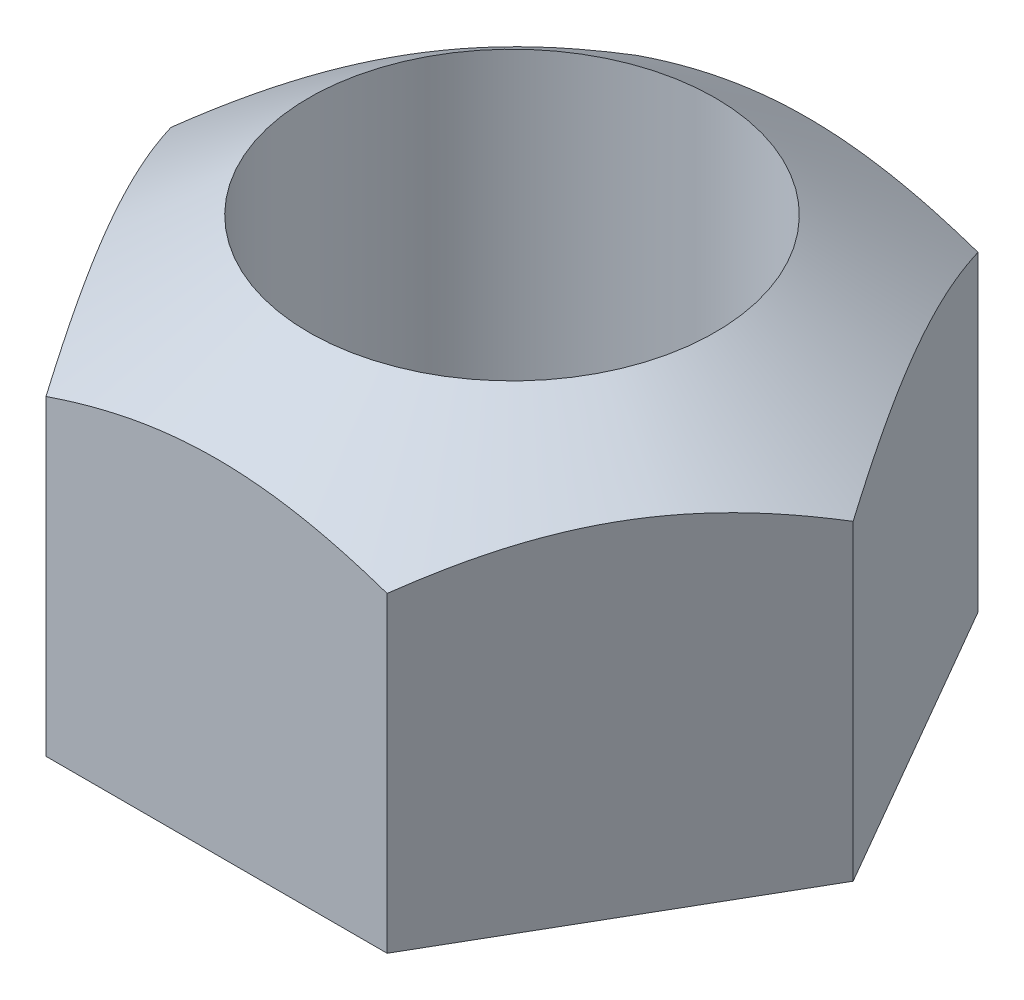
ISO-10303-21;
HEADER;
FILE_DESCRIPTION(('STEP AP214'),'2;1');
FILE_NAME('part.step','',(''),(''),'','','');
FILE_SCHEMA(('AUTOMOTIVE_DESIGN { 1 0 10303 214 1 1 1 1 }'));
ENDSEC;
DATA;
#1=APPLICATION_CONTEXT('core data for automotive mechanical design processes');
#2=APPLICATION_PROTOCOL_DEFINITION('international standard','automotive_design',2000,#1);
#3=PRODUCT_CONTEXT('',#1,'mechanical');
#4=PRODUCT('Part','Part','',(#3));
#5=PRODUCT_RELATED_PRODUCT_CATEGORY('part','',(#4));
#6=PRODUCT_DEFINITION_FORMATION('','',#4);
#7=PRODUCT_DEFINITION_CONTEXT('part definition',#1,'design');
#8=PRODUCT_DEFINITION('design','',#6,#7);
#9=PRODUCT_DEFINITION_SHAPE('','',#8);
#10=(LENGTH_UNIT() NAMED_UNIT(*) SI_UNIT(.MILLI.,.METRE.));
#11=(NAMED_UNIT(*) PLANE_ANGLE_UNIT() SI_UNIT($,.RADIAN.));
#12=(NAMED_UNIT(*) SI_UNIT($,.STERADIAN.) SOLID_ANGLE_UNIT());
#13=UNCERTAINTY_MEASURE_WITH_UNIT(LENGTH_MEASURE(1.E-05),#10,'distance_accuracy_value','');
#14=(GEOMETRIC_REPRESENTATION_CONTEXT(3) GLOBAL_UNCERTAINTY_ASSIGNED_CONTEXT((#13)) GLOBAL_UNIT_ASSIGNED_CONTEXT((#10,
#11,#12)) REPRESENTATION_CONTEXT('',''));
#15=CARTESIAN_POINT('',(0.,0.,0.));
#16=DIRECTION('',(0.,0.,1.));
#17=DIRECTION('',(1.,0.,0.));
#18=AXIS2_PLACEMENT_3D('',#15,#16,#17);
#19=CARTESIAN_POINT('',(1.25933103016914,3.,-2.18122532780094));
#20=DIRECTION('',(-0.866025403784442,0.,0.499999999999995));
#21=DIRECTION('',(-0.499999999999995,0.,-0.866025403784442));
#22=AXIS2_PLACEMENT_3D('',#19,#20,#21);
#23=PLANE('',#22);
#24=CARTESIAN_POINT('',(1.2592155601153,2.30087581787349,-2.18142532780094));
#25=CARTESIAN_POINT('',(1.31550954912703,2.33951770580844,-2.08392127867191));
#26=CARTESIAN_POINT('',(1.37248973223347,2.37474477407076,-1.98522870650698));
#27=CARTESIAN_POINT('',(1.48786595655928,2.43615499204039,-1.7853912239892));
#28=CARTESIAN_POINT('',(1.54626643940767,2.46230435580617,-1.68423862050924));
#29=CARTESIAN_POINT('',(1.66204339669967,2.50231176233432,-1.48370704813376));
#30=CARTESIAN_POINT('',(1.7193839650184,2.51656867006036,-1.38439027047084));
#31=CARTESIAN_POINT('',(1.8344049500676,2.53269232195834,-1.185168080429));
#32=CARTESIAN_POINT('',(1.89208450085089,2.53458284799929,-1.08526416791459));
#33=CARTESIAN_POINT('',(1.99742443675788,2.52657003491498,-0.90281004685764));
#34=CARTESIAN_POINT('',(2.04512528228465,2.518612189307,-0.820189758841276));
#35=CARTESIAN_POINT('',(2.14008033118028,2.49469928182791,-0.655722789718852));
#36=CARTESIAN_POINT('',(2.18733384624219,2.47873346032699,-0.573877300795405));
#37=CARTESIAN_POINT('',(2.28253038421269,2.43931005184523,-0.408992060325823));
#38=CARTESIAN_POINT('',(2.3304507890089,2.41563974118758,-0.325991484499524));
#39=CARTESIAN_POINT('',(2.42531974909352,2.36237008802023,-0.161673625571732));
#40=CARTESIAN_POINT('',(2.47227068755901,2.33278785842725,-0.0803522146864662));
#41=CARTESIAN_POINT('',(2.51877753039206,2.30087581787349,0.000200000000000081));
#42=B_SPLINE_CURVE_WITH_KNOTS('',3,(#24,#25,#26,#27,#28,#29,#30,#31,#32,#33,#34,#35,#36,#37,#38,
#39,#40,#41),.UNSPECIFIED.,.F.,.F.,(4,2,2,2,2,2,2,2,4),(0.,0.357339286163934,0.715994628041505,
1.06207297085613,1.40748557199856,1.69432755073411,1.98155597100773,2.27750419901166,
2.57260785628407),.UNSPECIFIED.);
#43=CARTESIAN_POINT('',(1.25933103016914,2.30095506329775,-2.18122532780094));
#44=VERTEX_POINT('',#43);
#45=CARTESIAN_POINT('',(2.51866206033823,2.30095506329775,0.));
#46=VERTEX_POINT('',#45);
#47=EDGE_CURVE('E98',#44,#46,#42,.T.);
#48=ORIENTED_EDGE('',*,*,#47,.T.);
#49=DIRECTION('',(0.,-1.,0.));
#50=VECTOR('',#49,1.);
#51=CARTESIAN_POINT('',(2.51866206033823,3.,0.));
#52=LINE('',#51,#50);
#53=CARTESIAN_POINT('',(2.51866206033823,0.,0.));
#54=VERTEX_POINT('',#53);
#55=EDGE_CURVE('E11',#46,#54,#52,.T.);
#56=ORIENTED_EDGE('',*,*,#55,.T.);
#57=DIRECTION('',(0.499999999999995,0.,0.866025403784441));
#58=VECTOR('',#57,1.);
#59=CARTESIAN_POINT('',(1.25933103016914,0.,-2.18122532780094));
#60=LINE('',#59,#58);
#61=CARTESIAN_POINT('',(1.25933103016914,0.,-2.18122532780094));
#62=VERTEX_POINT('',#61);
#63=EDGE_CURVE('E99',#62,#54,#60,.T.);
#64=ORIENTED_EDGE('',*,*,#63,.F.);
#65=DIRECTION('',(0.,-1.,0.));
#66=VECTOR('',#65,1.);
#67=CARTESIAN_POINT('',(1.25933103016914,3.,-2.18122532780094));
#68=LINE('',#67,#66);
#69=EDGE_CURVE('E88',#44,#62,#68,.T.);
#70=ORIENTED_EDGE('',*,*,#69,.F.);
#71=EDGE_LOOP('',(#48,#56,#64,#70));
#72=FACE_BOUND('',#71,.T.);
#73=ADVANCED_FACE('F34',(#72),#23,.F.);
#74=CARTESIAN_POINT('',(2.51866206033823,3.,0.));
#75=DIRECTION('',(-0.866025403784438,0.,-0.500000000000001));
#76=DIRECTION('',(0.500000000000001,0.,-0.866025403784438));
#77=AXIS2_PLACEMENT_3D('',#74,#75,#76);
#78=PLANE('',#77);
#79=CARTESIAN_POINT('',(2.51877753039206,2.30087581787349,-0.000200000000000002));
#80=CARTESIAN_POINT('',(2.46248354138034,2.33951770580844,0.0973040491290325));
#81=CARTESIAN_POINT('',(2.4055033582739,2.37474477407076,0.195996621293965));
#82=CARTESIAN_POINT('',(2.29012713394808,2.43615499204039,0.39583410381174));
#83=CARTESIAN_POINT('',(2.2317266510997,2.46230435580617,0.496986707291701));
#84=CARTESIAN_POINT('',(2.11594969380769,2.50231176233433,0.69751827966718));
#85=CARTESIAN_POINT('',(2.05860912548896,2.51656867006036,0.796835057330098));
#86=CARTESIAN_POINT('',(1.94358814043975,2.53269232195834,0.996057247371943));
#87=CARTESIAN_POINT('',(1.88590858965646,2.5345828479993,1.09596115988635));
#88=CARTESIAN_POINT('',(1.78056865374948,2.52657003491498,1.2784152809433));
#89=CARTESIAN_POINT('',(1.73286780822271,2.51861218930701,1.36103556895967));
#90=CARTESIAN_POINT('',(1.63791275932707,2.49469928182791,1.52550253808209));
#91=CARTESIAN_POINT('',(1.59065924426516,2.478733460327,1.60734802700554));
#92=CARTESIAN_POINT('',(1.49546270629465,2.43931005184524,1.77223326747513));
#93=CARTESIAN_POINT('',(1.44754230149844,2.41563974118758,1.85523384330143));
#94=CARTESIAN_POINT('',(1.35267334141381,2.36237008802023,2.01955170222923));
#95=CARTESIAN_POINT('',(1.30572240294832,2.33278785842725,2.10087311311449));
#96=CARTESIAN_POINT('',(1.25921556011527,2.30087581787349,2.18142532780096));
#97=B_SPLINE_CURVE_WITH_KNOTS('',3,(#79,#80,#81,#82,#83,#84,#85,#86,#87,#88,#89,#90,#91,#92,#93,
#94,#95,#96),.UNSPECIFIED.,.F.,.F.,(4,2,2,2,2,2,2,2,4),(0.,0.357339286163933,0.715994628041505,
1.06207297085613,1.40748557199856,1.69432755073412,1.98155597100775,2.27750419901169,
2.5726078562841),.UNSPECIFIED.);
#98=CARTESIAN_POINT('',(1.25933103016911,2.30095506329775,2.18122532780096));
#99=VERTEX_POINT('',#98);
#100=EDGE_CURVE('E103',#46,#99,#97,.T.);
#101=ORIENTED_EDGE('',*,*,#100,.T.);
#102=DIRECTION('',(0.,-1.,0.));
#103=VECTOR('',#102,1.);
#104=CARTESIAN_POINT('',(1.25933103016911,3.,2.18122532780096));
#105=LINE('',#104,#103);
#106=CARTESIAN_POINT('',(1.25933103016911,0.,2.18122532780096));
#107=VERTEX_POINT('',#106);
#108=EDGE_CURVE('E42',#99,#107,#105,.T.);
#109=ORIENTED_EDGE('',*,*,#108,.T.);
#110=DIRECTION('',(-0.500000000000001,0.,0.866025403784438));
#111=VECTOR('',#110,1.);
#112=CARTESIAN_POINT('',(2.51866206033823,0.,0.));
#113=LINE('',#112,#111);
#114=EDGE_CURVE('E168',#54,#107,#113,.T.);
#115=ORIENTED_EDGE('',*,*,#114,.F.);
#116=ORIENTED_EDGE('',*,*,#55,.F.);
#117=EDGE_LOOP('',(#101,#109,#115,#116));
#118=FACE_BOUND('',#117,.T.);
#119=ADVANCED_FACE('F156',(#118),#78,.F.);
#120=CARTESIAN_POINT('',(1.25933103016911,3.,2.18122532780096));
#121=DIRECTION('',(0.,0.,-1.));
#122=DIRECTION('',(1.,0.,0.));
#123=AXIS2_PLACEMENT_3D('',#120,#121,#122);
#124=PLANE('',#123);
#125=CARTESIAN_POINT('',(-2.9545450350747,1.50916369824125,2.18122532780095));
#126=CARTESIAN_POINT('',(-2.87346247800183,1.55391619738643,2.18122532780095));
#127=CARTESIAN_POINT('',(-2.79211123068346,1.59819019822394,2.18122532780095));
#128=CARTESIAN_POINT('',(-2.62874504800034,1.68553581362289,2.18122532780095));
#129=CARTESIAN_POINT('',(-2.54672997962849,1.72860717911831,2.18122532780095));
#130=CARTESIAN_POINT('',(-2.38141985712409,1.81355239217774,2.18122532780095));
#131=CARTESIAN_POINT('',(-2.29811998201679,1.85541689789581,2.18122532780095));
#132=CARTESIAN_POINT('',(-2.13062440357136,1.93730416573763,2.18122532780095));
#133=CARTESIAN_POINT('',(-2.04642875109432,1.97732703174742,2.18122532780095));
#134=CARTESIAN_POINT('',(-1.87418945377928,2.05636658246092,2.18122532780095));
#135=CARTESIAN_POINT('',(-1.78611032963814,2.09530687400139,2.18122532780095));
#136=CARTESIAN_POINT('',(-1.60865179037639,2.17009360724526,2.18122532780095));
#137=CARTESIAN_POINT('',(-1.51927221048556,2.20593965284181,2.18122532780095));
#138=CARTESIAN_POINT('',(-1.24930615482284,2.30748632166548,2.18122532780095));
#139=CARTESIAN_POINT('',(-1.06639276374475,2.36743444041913,2.18122532780095));
#140=CARTESIAN_POINT('',(-0.778989981047283,2.44122380207046,2.18122532780095));
#141=CARTESIAN_POINT('',(-0.676712322297377,2.46363031890074,2.18122532780095));
#142=CARTESIAN_POINT('',(-0.4705863588114,2.49960438296615,2.18122532780095));
#143=CARTESIAN_POINT('',(-0.366738350229837,2.51317357608709,2.18122532780095));
#144=CARTESIAN_POINT('',(-0.159758731770357,2.53013712444937,2.18122532780096));
#145=CARTESIAN_POINT('',(-0.056639682847937,2.53368080925315,2.18122532780096));
#146=CARTESIAN_POINT('',(0.149456055794941,2.53067583953558,2.18122532780096));
#147=CARTESIAN_POINT('',(0.252432726438349,2.52412594319491,2.18122532780096));
#148=CARTESIAN_POINT('',(0.479143972253766,2.49914052760369,2.18122532780096));
#149=CARTESIAN_POINT('',(0.602629408111094,2.4784710744729,2.18122532780096));
#150=CARTESIAN_POINT('',(0.847084901545143,2.42558855429311,2.18122532780096));
#151=CARTESIAN_POINT('',(0.968053360088176,2.39336837254865,2.18122532780096));
#152=CARTESIAN_POINT('',(1.21008829036824,2.31925604873269,2.18122532780096));
#153=CARTESIAN_POINT('',(1.3310885773138,2.27715197036705,2.18122532780096));
#154=CARTESIAN_POINT('',(1.5106027100214,2.20892436727187,2.18122532780096));
#155=CARTESIAN_POINT('',(1.57010675771118,2.18533790094223,2.18122532780096));
#156=CARTESIAN_POINT('',(1.68851703760574,2.13670986874041,2.18122532780096));
#157=CARTESIAN_POINT('',(1.7474232844238,2.11166833853849,2.18122532780096));
#158=CARTESIAN_POINT('',(1.90762522010628,2.04155758079451,2.18122532780096));
#159=CARTESIAN_POINT('',(2.00837791929637,1.99524922449169,2.18122532780096));
#160=CARTESIAN_POINT('',(2.20853095800985,1.89978599831886,2.18122532780096));
#161=CARTESIAN_POINT('',(2.30793111241537,1.85063074354866,2.18122532780096));
#162=CARTESIAN_POINT('',(2.50565159540418,1.7500932199014,2.18122532780097));
#163=CARTESIAN_POINT('',(2.60397141336838,1.69870995029641,2.18122532780097));
#164=CARTESIAN_POINT('',(2.79968504758028,1.59420568735874,2.18122532780097));
#165=CARTESIAN_POINT('',(2.89707882410792,1.54108461991799,2.18122532780097));
#166=CARTESIAN_POINT('',(3.18854628848185,1.37943124694895,2.18122532780097));
#167=CARTESIAN_POINT('',(3.38147299718189,1.26883322435877,2.18122532780097));
#168=CARTESIAN_POINT('',(3.76515808920532,1.04408278211513,2.18122532780097));
#169=CARTESIAN_POINT('',(3.95591703137348,0.929931308273863,2.18122532780097));
#170=CARTESIAN_POINT('',(4.31501537780739,0.7118425909364,2.18122532780097));
#171=CARTESIAN_POINT('',(4.48351197368359,0.608163605104562,2.18122532780097));
#172=CARTESIAN_POINT('',(4.81960951660078,0.39933843574813,2.18122532780097));
#173=CARTESIAN_POINT('',(4.98721039465685,0.294192141406126,2.18122532780097));
#174=CARTESIAN_POINT('',(5.32091295374186,0.0832999653749003,2.18122532780097));
#175=CARTESIAN_POINT('',(5.48701797130935,-0.0224406445819515,2.18122532780098));
#176=CARTESIAN_POINT('',(5.81865729675664,-0.234775030986317,2.18122532780098));
#177=CARTESIAN_POINT('',(5.98419166316863,-0.341368715968136,2.18122532780098));
#178=CARTESIAN_POINT('',(6.14951926489574,-0.448279497522099,2.18122532780098));
#179=B_SPLINE_CURVE_WITH_KNOTS('',3,(#125,#126,#127,#128,#129,#130,#131,#132,#133,#134,#135,
#136,#137,#138,#139,#140,#141,#142,#143,#144,#145,#146,#147,#148,#149,#150,#151,#152,#153,#154,
#155,#156,#157,#158,#159,#160,#161,#162,#163,#164,#165,#166,#167,#168,#169,#170,#171,#172,#173,
#174,#175,#176,#177,#178),.UNSPECIFIED.,.F.,.F.,(4,2,2,2,2,2,2,2,2,2,2,2,2,2,2,2,2,2,2,2,2,2,2,
2,2,2,4),(0.,0.27784325577889,0.555743632462185,0.835408813840751,1.11505820004625,
1.40390564193875,1.69279000568425,2.26890055641248,2.58270416122484,2.89644930572447,
3.20549597969341,3.5145806788951,3.88948201642559,4.26461467310424,4.64867523063798,
4.84068616901104,5.03269240230253,5.36528519802965,5.69792306569619,6.03071191974164,
6.36351498405598,7.03058394892152,7.69747685500769,8.29098513310448,8.8845384807159,
9.47525343023665,10.0659058706072),.UNSPECIFIED.);
#180=CARTESIAN_POINT('',(-1.25933103016912,2.30095506329775,2.18122532780095));
#181=VERTEX_POINT('',#180);
#182=EDGE_CURVE('E109',#99,#181,#179,.F.);
#183=ORIENTED_EDGE('',*,*,#182,.T.);
#184=DIRECTION('',(0.,-1.,0.));
#185=VECTOR('',#184,1.);
#186=CARTESIAN_POINT('',(-1.25933103016912,3.,2.18122532780095));
#187=LINE('',#186,#185);
#188=CARTESIAN_POINT('',(-1.25933103016912,0.,2.18122532780095));
#189=VERTEX_POINT('',#188);
#190=EDGE_CURVE('E186',#181,#189,#187,.T.);
#191=ORIENTED_EDGE('',*,*,#190,.T.);
#192=DIRECTION('',(-1.,0.,0.));
#193=VECTOR('',#192,1.);
#194=CARTESIAN_POINT('',(1.25933103016911,0.,2.18122532780096));
#195=LINE('',#194,#193);
#196=EDGE_CURVE('E170',#107,#189,#195,.T.);
#197=ORIENTED_EDGE('',*,*,#196,.F.);
#198=ORIENTED_EDGE('',*,*,#108,.F.);
#199=EDGE_LOOP('',(#183,#191,#197,#198));
#200=FACE_BOUND('',#199,.T.);
#201=ADVANCED_FACE('F152',(#200),#124,.F.);
#202=CARTESIAN_POINT('',(-1.25933103016912,3.,2.18122532780095));
#203=DIRECTION('',(0.866025403784441,0.,-0.499999999999995));
#204=DIRECTION('',(0.499999999999995,0.,0.866025403784442));
#205=AXIS2_PLACEMENT_3D('',#202,#203,#204);
#206=PLANE('',#205);
#207=CARTESIAN_POINT('',(-1.25921556011528,2.30087581787349,2.18142532780095));
#208=CARTESIAN_POINT('',(-1.31550954912701,2.33951770580844,2.08392127867192));
#209=CARTESIAN_POINT('',(-1.37248973223345,2.37474477407076,1.98522870650699));
#210=CARTESIAN_POINT('',(-1.48786595655926,2.43615499204039,1.78539122398921));
#211=CARTESIAN_POINT('',(-1.54626643940765,2.46230435580617,1.68423862050925));
#212=CARTESIAN_POINT('',(-1.66204339669965,2.50231176233433,1.48370704813377));
#213=CARTESIAN_POINT('',(-1.71938396501838,2.51656867006036,1.38439027047085));
#214=CARTESIAN_POINT('',(-1.83440495006759,2.53269232195834,1.185168080429));
#215=CARTESIAN_POINT('',(-1.89208450085088,2.5345828479993,1.0852641679146));
#216=CARTESIAN_POINT('',(-1.99742443675786,2.52657003491498,0.902810046857648));
#217=CARTESIAN_POINT('',(-2.04512528228463,2.51861218930701,0.820189758841281));
#218=CARTESIAN_POINT('',(-2.14008033118027,2.49469928182791,0.655722789718854));
#219=CARTESIAN_POINT('',(-2.18733384624218,2.478733460327,0.573877300795404));
#220=CARTESIAN_POINT('',(-2.28253038421269,2.43931005184524,0.408992060325817));
#221=CARTESIAN_POINT('',(-2.3304507890089,2.41563974118758,0.325991484499515));
#222=CARTESIAN_POINT('',(-2.42531974909352,2.36237008802023,0.161673625571719));
#223=CARTESIAN_POINT('',(-2.47227068755901,2.33278785842725,0.0803522146864509));
#224=CARTESIAN_POINT('',(-2.51877753039206,2.30087581787349,-0.000200000000017315));
#225=B_SPLINE_CURVE_WITH_KNOTS('',3,(#207,#208,#209,#210,#211,#212,#213,#214,#215,#216,#217,
#218,#219,#220,#221,#222,#223,#224),.UNSPECIFIED.,.F.,.F.,(4,2,2,2,2,2,2,2,4),(0.,
0.357339286163934,0.715994628041505,1.06207297085613,1.40748557199856,1.69432755073412,
1.98155597100775,2.27750419901169,2.5726078562841),.UNSPECIFIED.);
#226=CARTESIAN_POINT('',(-2.51866206033823,2.30095506329775,0.));
#227=VERTEX_POINT('',#226);
#228=EDGE_CURVE('E142',#181,#227,#225,.T.);
#229=ORIENTED_EDGE('',*,*,#228,.T.);
#230=DIRECTION('',(0.,-1.,0.));
#231=VECTOR('',#230,1.);
#232=CARTESIAN_POINT('',(-2.51866206033823,3.,0.));
#233=LINE('',#232,#231);
#234=CARTESIAN_POINT('',(-2.51866206033823,0.,0.));
#235=VERTEX_POINT('',#234);
#236=EDGE_CURVE('E183',#227,#235,#233,.T.);
#237=ORIENTED_EDGE('',*,*,#236,.T.);
#238=DIRECTION('',(-0.499999999999995,0.,-0.866025403784442));
#239=VECTOR('',#238,1.);
#240=CARTESIAN_POINT('',(-1.25933103016912,0.,2.18122532780095));
#241=LINE('',#240,#239);
#242=EDGE_CURVE('E176',#189,#235,#241,.T.);
#243=ORIENTED_EDGE('',*,*,#242,.F.);
#244=ORIENTED_EDGE('',*,*,#190,.F.);
#245=EDGE_LOOP('',(#229,#237,#243,#244));
#246=FACE_BOUND('',#245,.T.);
#247=ADVANCED_FACE('F155',(#246),#206,.F.);
#248=CARTESIAN_POINT('',(-2.51866206033823,3.,0.));
#249=DIRECTION('',(0.866025403784434,0.,0.500000000000007));
#250=DIRECTION('',(-0.500000000000007,0.,0.866025403784435));
#251=AXIS2_PLACEMENT_3D('',#248,#249,#250);
#252=PLANE('',#251);
#253=CARTESIAN_POINT('',(-2.51877753039206,2.30087581787349,0.000199999999982413));
#254=CARTESIAN_POINT('',(-2.46248354138034,2.33951770580844,-0.0973040491290498));
#255=CARTESIAN_POINT('',(-2.4055033582739,2.37474477407076,-0.195996621293982));
#256=CARTESIAN_POINT('',(-2.29012713394808,2.43615499204039,-0.395834103811756));
#257=CARTESIAN_POINT('',(-2.23172665109969,2.46230435580617,-0.496986707291717));
#258=CARTESIAN_POINT('',(-2.11594969380769,2.50231176233433,-0.697518279667195));
#259=CARTESIAN_POINT('',(-2.05860912548896,2.51656867006036,-0.796835057330112));
#260=CARTESIAN_POINT('',(-1.94358814043975,2.53269232195834,-0.996057247371956));
#261=CARTESIAN_POINT('',(-1.88590858965646,2.5345828479993,-1.09596115988637));
#262=CARTESIAN_POINT('',(-1.78056865374947,2.52657003491498,-1.27841528094331));
#263=CARTESIAN_POINT('',(-1.7328678082227,2.51861218930701,-1.36103556895968));
#264=CARTESIAN_POINT('',(-1.63791275932706,2.49469928182791,-1.5255025380821));
#265=CARTESIAN_POINT('',(-1.59065924426515,2.478733460327,-1.60734802700555));
#266=CARTESIAN_POINT('',(-1.49546270629464,2.43931005184524,-1.77223326747514));
#267=CARTESIAN_POINT('',(-1.44754230149843,2.41563974118758,-1.85523384330144));
#268=CARTESIAN_POINT('',(-1.3526733414138,2.36237008802023,-2.01955170222923));
#269=CARTESIAN_POINT('',(-1.30572240294831,2.33278785842725,-2.1008731131145));
#270=CARTESIAN_POINT('',(-1.25921556011525,2.30087581787349,-2.18142532780097));
#271=B_SPLINE_CURVE_WITH_KNOTS('',3,(#253,#254,#255,#256,#257,#258,#259,#260,#261,#262,#263,
#264,#265,#266,#267,#268,#269,#270),.UNSPECIFIED.,.F.,.F.,(4,2,2,2,2,2,2,2,4),(0.,
0.357339286163933,0.715994628041505,1.06207297085613,1.40748557199856,1.69432755073412,
1.98155597100775,2.27750419901169,2.5726078562841),.UNSPECIFIED.);
#272=CARTESIAN_POINT('',(-1.25933103016909,2.30095506329775,-2.18122532780097));
#273=VERTEX_POINT('',#272);
#274=EDGE_CURVE('E93',#227,#273,#271,.T.);
#275=ORIENTED_EDGE('',*,*,#274,.T.);
#276=DIRECTION('',(0.,-1.,0.));
#277=VECTOR('',#276,1.);
#278=CARTESIAN_POINT('',(-1.25933103016909,3.,-2.18122532780097));
#279=LINE('',#278,#277);
#280=CARTESIAN_POINT('',(-1.25933103016909,0.,-2.18122532780097));
#281=VERTEX_POINT('',#280);
#282=EDGE_CURVE('E91',#273,#281,#279,.T.);
#283=ORIENTED_EDGE('',*,*,#282,.T.);
#284=DIRECTION('',(0.500000000000007,0.,-0.866025403784434));
#285=VECTOR('',#284,1.);
#286=CARTESIAN_POINT('',(-2.51866206033823,0.,0.));
#287=LINE('',#286,#285);
#288=EDGE_CURVE('E179',#235,#281,#287,.T.);
#289=ORIENTED_EDGE('',*,*,#288,.F.);
#290=ORIENTED_EDGE('',*,*,#236,.F.);
#291=EDGE_LOOP('',(#275,#283,#289,#290));
#292=FACE_BOUND('',#291,.T.);
#293=ADVANCED_FACE('F193',(#292),#252,.F.);
#294=CARTESIAN_POINT('',(-1.25933103016909,3.,-2.18122532780097));
#295=DIRECTION('',(0.,0.,1.));
#296=DIRECTION('',(-1.,0.,0.));
#297=AXIS2_PLACEMENT_3D('',#294,#295,#296);
#298=PLANE('',#297);
#299=CARTESIAN_POINT('',(-2.9545450360568,1.50916369769904,-2.18122532780099));
#300=CARTESIAN_POINT('',(-2.87346247895345,1.55391619686628,-2.18122532780099));
#301=CARTESIAN_POINT('',(-2.79211123160456,1.59819019772584,-2.18122532780099));
#302=CARTESIAN_POINT('',(-2.62874504886027,1.68553581316878,-2.18122532780098));
#303=CARTESIAN_POINT('',(-2.54672998045775,1.72860717868614,-2.18122532780098));
#304=CARTESIAN_POINT('',(-2.38141985789124,1.81355239178958,-2.18122532780098));
#305=CARTESIAN_POINT('',(-2.29811998275249,1.85541689752971,-2.18122532780098));
#306=CARTESIAN_POINT('',(-2.13062440424385,1.93730416541525,-2.18122532780098));
#307=CARTESIAN_POINT('',(-2.04642875173504,1.97732703144672,-2.18122532780098));
#308=CARTESIAN_POINT('',(-1.87418945435149,2.05636658220522,-2.18122532780098));
#309=CARTESIAN_POINT('',(-1.78611033017353,2.09530687376891,-2.18122532780097));
#310=CARTESIAN_POINT('',(-1.60865179083734,2.17009360705781,-2.18122532780097));
#311=CARTESIAN_POINT('',(-1.51927221090888,2.20593965267619,-2.18122532780097));
#312=CARTESIAN_POINT('',(-1.24930615513218,2.30748632156191,-2.18122532780097));
#313=CARTESIAN_POINT('',(-1.06639276397596,2.36743444035275,-2.18122532780097));
#314=CARTESIAN_POINT('',(-0.778989981230059,2.44122380202733,-2.18122532780096));
#315=CARTESIAN_POINT('',(-0.676712322513242,2.46363031885574,-2.18122532780096));
#316=CARTESIAN_POINT('',(-0.470586359093958,2.49960438292415,-2.18122532780096));
#317=CARTESIAN_POINT('',(-0.366738350545999,2.51317357604995,-2.18122532780096));
#318=CARTESIAN_POINT('',(-0.159758732153177,2.53013712442904,-2.18122532780096));
#319=CARTESIAN_POINT('',(-0.0566396832638224,2.5336808092447,-2.18122532780096));
#320=CARTESIAN_POINT('',(0.149456055314435,2.53067583955711,-2.18122532780095));
#321=CARTESIAN_POINT('',(0.252432725926289,2.52412594323454,-2.18122532780095));
#322=CARTESIAN_POINT('',(0.479143971666494,2.4991405276888,-2.18122532780095));
#323=CARTESIAN_POINT('',(0.60262940748075,2.47847107458724,-2.18122532780095));
#324=CARTESIAN_POINT('',(0.847084900831553,2.42558855446962,-2.18122532780095));
#325=CARTESIAN_POINT('',(0.968053359334414,2.39336837275809,-2.18122532780095));
#326=CARTESIAN_POINT('',(1.21008828953481,2.31925604900981,-2.18122532780094));
#327=CARTESIAN_POINT('',(1.33108857644093,2.27715197067896,-2.18122532780094));
#328=CARTESIAN_POINT('',(1.51060270909015,2.20892436763571,-2.18122532780094));
#329=CARTESIAN_POINT('',(1.57010675676062,2.18533790132333,-2.18122532780094));
#330=CARTESIAN_POINT('',(1.68851703661672,2.13670986915587,-2.18122532780094));
#331=CARTESIAN_POINT('',(1.74742328341563,2.11166833897107,-2.18122532780094));
#332=CARTESIAN_POINT('',(1.90762521908736,2.04155758125545,-2.18122532780094));
#333=CARTESIAN_POINT('',(2.0083779182853,1.99524922496218,-2.18122532780094));
#334=CARTESIAN_POINT('',(2.20853095701355,1.89978599880581,-2.18122532780093));
#335=CARTESIAN_POINT('',(2.30793111142599,1.8506307440425,-2.18122532780093));
#336=CARTESIAN_POINT('',(2.50565159442795,1.75009322040708,-2.18122532780093));
#337=CARTESIAN_POINT('',(2.60397141239837,1.69870995080701,-2.18122532780093));
#338=CARTESIAN_POINT('',(2.79968504662208,1.59420568787775,-2.18122532780093));
#339=CARTESIAN_POINT('',(2.8970788231553,1.54108462044047,-2.18122532780093));
#340=CARTESIAN_POINT('',(3.18854628754597,1.3794312474799,-2.18122532780092));
#341=CARTESIAN_POINT('',(3.38147299625637,1.26883322489309,-2.18122532780092));
#342=CARTESIAN_POINT('',(3.76515808829912,1.04408278265375,-2.18122532780092));
#343=CARTESIAN_POINT('',(3.95591703047622,0.929931308813437,-2.18122532780092));
#344=CARTESIAN_POINT('',(4.31501537691973,0.711842591480282,-2.18122532780091));
#345=CARTESIAN_POINT('',(4.4835119727967,0.608163605652034,-2.18122532780091));
#346=CARTESIAN_POINT('',(4.81960951571506,0.399338436302052,-2.18122532780091));
#347=CARTESIAN_POINT('',(4.98721039377151,0.294192141962907,-2.1812253278009));
#348=CARTESIAN_POINT('',(5.32091295285572,0.083299965937685,-2.1812253278009));
#349=CARTESIAN_POINT('',(5.48701797042204,-0.0224406440160105,-2.1812253278009));
#350=CARTESIAN_POINT('',(5.81865729586673,-0.234775030414398,-2.1812253278009));
#351=CARTESIAN_POINT('',(5.98419166227731,-0.341368715393395,-2.18122532780089));
#352=CARTESIAN_POINT('',(6.14951926400293,-0.448279496944649,-2.18122532780089));
#353=B_SPLINE_CURVE_WITH_KNOTS('',3,(#299,#300,#301,#302,#303,#304,#305,#306,#307,#308,#309,
#310,#311,#312,#313,#314,#315,#316,#317,#318,#319,#320,#321,#322,#323,#324,#325,#326,#327,#328,
#329,#330,#331,#332,#333,#334,#335,#336,#337,#338,#339,#340,#341,#342,#343,#344,#345,#346,#347,
#348,#349,#350,#351,#352),.UNSPECIFIED.,.F.,.F.,(4,2,2,2,2,2,2,2,2,2,2,2,2,2,2,2,2,2,2,2,2,2,2,
2,2,2,4),(0.,0.277843255890923,0.555743632686276,0.835408814178842,1.11505820049832,
1.40390564251995,1.69279000639465,2.2689005573789,2.58270416209347,2.89644930649554,
3.20549598036708,3.51458067947122,3.88948201686021,4.264614673397,4.64867523078462,
4.84068616908474,5.03269240230327,5.36528519803968,5.6979230657156,6.03071191977072,
6.36351498409476,7.03058394898217,7.69747685508988,8.290985133183,8.88453848079084,
9.47525343030353,10.0659058706659),.UNSPECIFIED.);
#354=EDGE_CURVE('E49',#273,#44,#353,.T.);
#355=ORIENTED_EDGE('',*,*,#354,.T.);
#356=ORIENTED_EDGE('',*,*,#69,.T.);
#357=DIRECTION('',(1.,0.,0.));
#358=VECTOR('',#357,1.);
#359=CARTESIAN_POINT('',(-1.25933103016909,0.,-2.18122532780097));
#360=LINE('',#359,#358);
#361=EDGE_CURVE('E57',#281,#62,#360,.T.);
#362=ORIENTED_EDGE('',*,*,#361,.F.);
#363=ORIENTED_EDGE('',*,*,#282,.F.);
#364=EDGE_LOOP('',(#355,#356,#362,#363));
#365=FACE_BOUND('',#364,.T.);
#366=ADVANCED_FACE('F87',(#365),#298,.F.);
#367=CARTESIAN_POINT('',(0.,0.,0.));
#368=DIRECTION('',(0.,1.,0.));
#369=DIRECTION('',(0.,0.,-1.));
#370=AXIS2_PLACEMENT_3D('',#367,#368,#369);
#371=PLANE('',#370);
#372=ORIENTED_EDGE('',*,*,#63,.T.);
#373=ORIENTED_EDGE('',*,*,#114,.T.);
#374=ORIENTED_EDGE('',*,*,#196,.T.);
#375=ORIENTED_EDGE('',*,*,#242,.T.);
#376=ORIENTED_EDGE('',*,*,#288,.T.);
#377=ORIENTED_EDGE('',*,*,#361,.T.);
#378=EDGE_LOOP('',(#372,#373,#374,#375,#376,#377));
#379=FACE_BOUND('',#378,.T.);
#380=CARTESIAN_POINT('',(0.,0.,0.));
#381=DIRECTION('',(0.,-1.,0.));
#382=DIRECTION('',(0.,0.,-1.));
#383=AXIS2_PLACEMENT_3D('',#380,#381,#382);
#384=CIRCLE('',#383,1.5);
#385=CARTESIAN_POINT('',(0.,0.,-1.5));
#386=VERTEX_POINT('',#385);
#387=EDGE_CURVE('E105',#386,#386,#384,.T.);
#388=ORIENTED_EDGE('',*,*,#387,.F.);
#389=EDGE_LOOP('',(#388));
#390=FACE_BOUND('',#389,.T.);
#391=ADVANCED_FACE('F172',(#379,#390),#371,.F.);
#392=CARTESIAN_POINT('',(0.,3.,0.));
#393=DIRECTION('',(0.,-1.,0.));
#394=DIRECTION('',(0.,0.,1.));
#395=AXIS2_PLACEMENT_3D('',#392,#393,#394);
#396=CYLINDRICAL_SURFACE('',#395,1.5);
#397=CARTESIAN_POINT('',(0.,3.,0.));
#398=DIRECTION('',(0.,-1.,0.));
#399=DIRECTION('',(0.,0.,-1.));
#400=AXIS2_PLACEMENT_3D('',#397,#398,#399);
#401=CIRCLE('',#400,1.5);
#402=CARTESIAN_POINT('',(0.,3.,-1.5));
#403=VERTEX_POINT('',#402);
#404=EDGE_CURVE('E94',#403,#403,#401,.T.);
#405=ORIENTED_EDGE('',*,*,#404,.F.);
#406=EDGE_LOOP('',(#405));
#407=FACE_BOUND('',#406,.T.);
#408=ORIENTED_EDGE('',*,*,#387,.T.);
#409=EDGE_LOOP('',(#408));
#410=FACE_BOUND('',#409,.T.);
#411=ADVANCED_FACE('F123',(#407,#410),#396,.F.);
#412=CARTESIAN_POINT('',(0.,3.,0.));
#413=DIRECTION('',(0.,-1.,0.));
#414=DIRECTION('',(0.,0.,1.));
#415=AXIS2_PLACEMENT_3D('',#412,#413,#414);
#416=CONICAL_SURFACE('',#415,1.5,0.969366225809016);
#417=ORIENTED_EDGE('',*,*,#404,.T.);
#418=EDGE_LOOP('',(#417));
#419=FACE_BOUND('',#418,.T.);
#420=ORIENTED_EDGE('',*,*,#47,.F.);
#421=ORIENTED_EDGE('',*,*,#354,.F.);
#422=ORIENTED_EDGE('',*,*,#274,.F.);
#423=ORIENTED_EDGE('',*,*,#228,.F.);
#424=ORIENTED_EDGE('',*,*,#182,.F.);
#425=ORIENTED_EDGE('',*,*,#100,.F.);
#426=EDGE_LOOP('',(#420,#421,#422,#423,#424,#425));
#427=FACE_BOUND('',#426,.T.);
#428=ADVANCED_FACE('F101',(#419,#427),#416,.T.);
#429=CLOSED_SHELL('',(#73,#119,#201,#247,#293,#366,#391,#411,#428));
#430=MANIFOLD_SOLID_BREP('B2',#429);
#431=ADVANCED_BREP_SHAPE_REPRESENTATION('',(#18,#430),#14);
#432=SHAPE_DEFINITION_REPRESENTATION(#9,#431);
ENDSEC;
END-ISO-10303-21;
